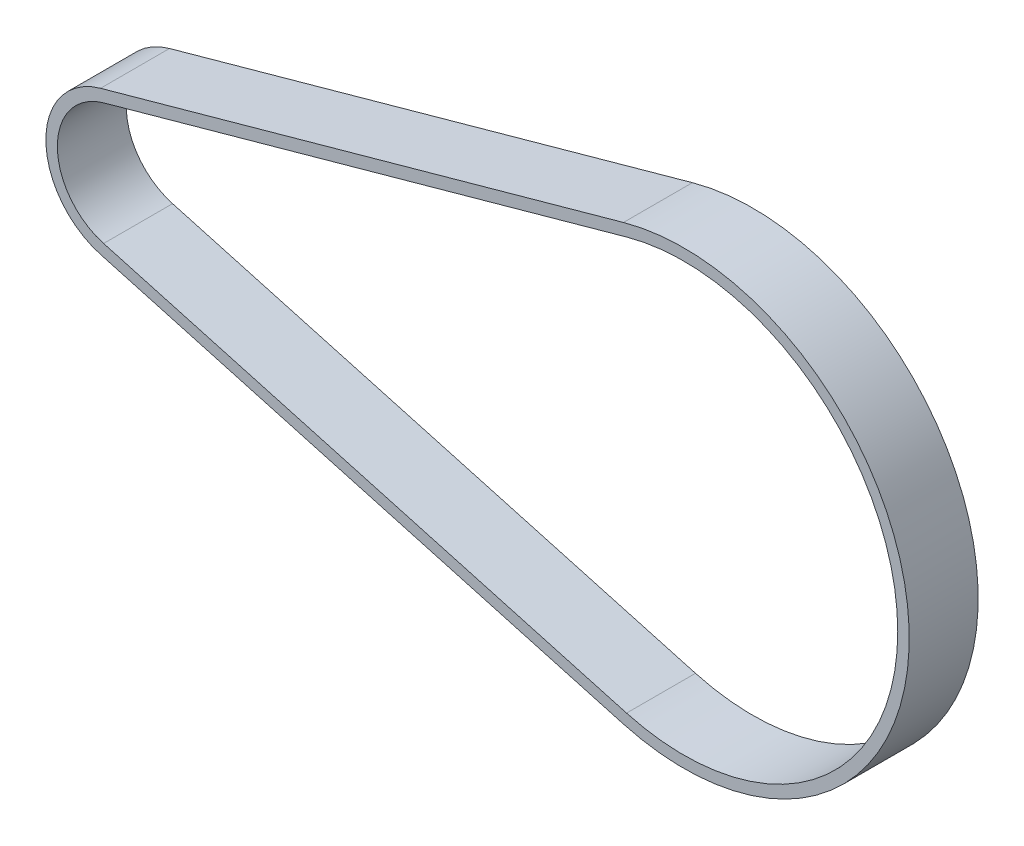
ISO-10303-21;
HEADER;
FILE_DESCRIPTION(('STEP AP214'),'2;1');
FILE_NAME('part.step','',(''),(''),'','','');
FILE_SCHEMA(('AUTOMOTIVE_DESIGN { 1 0 10303 214 1 1 1 1 }'));
ENDSEC;
DATA;
#1=APPLICATION_CONTEXT('core data for automotive mechanical design processes');
#2=APPLICATION_PROTOCOL_DEFINITION('international standard','automotive_design',2000,#1);
#3=PRODUCT_CONTEXT('',#1,'mechanical');
#4=PRODUCT('Part','Part','',(#3));
#5=PRODUCT_RELATED_PRODUCT_CATEGORY('part','',(#4));
#6=PRODUCT_DEFINITION_FORMATION('','',#4);
#7=PRODUCT_DEFINITION_CONTEXT('part definition',#1,'design');
#8=PRODUCT_DEFINITION('design','',#6,#7);
#9=PRODUCT_DEFINITION_SHAPE('','',#8);
#10=(LENGTH_UNIT() NAMED_UNIT(*) SI_UNIT(.MILLI.,.METRE.));
#11=(NAMED_UNIT(*) PLANE_ANGLE_UNIT() SI_UNIT($,.RADIAN.));
#12=(NAMED_UNIT(*) SI_UNIT($,.STERADIAN.) SOLID_ANGLE_UNIT());
#13=UNCERTAINTY_MEASURE_WITH_UNIT(LENGTH_MEASURE(1.E-05),#10,'distance_accuracy_value','');
#14=(GEOMETRIC_REPRESENTATION_CONTEXT(3) GLOBAL_UNCERTAINTY_ASSIGNED_CONTEXT((#13)) GLOBAL_UNIT_ASSIGNED_CONTEXT((#10,
#11,#12)) REPRESENTATION_CONTEXT('',''));
#15=CARTESIAN_POINT('',(0.,0.,0.));
#16=DIRECTION('',(0.,0.,1.));
#17=DIRECTION('',(1.,0.,0.));
#18=AXIS2_PLACEMENT_3D('',#15,#16,#17);
#19=CARTESIAN_POINT('',(0.,0.,6.));
#20=DIRECTION('',(0.,0.,1.));
#21=DIRECTION('',(1.,0.,0.));
#22=AXIS2_PLACEMENT_3D('',#19,#20,#21);
#23=PLANE('',#22);
#24=CARTESIAN_POINT('',(0.,0.,6.));
#25=DIRECTION('',(0.,0.,1.));
#26=DIRECTION('',(1.,0.,0.));
#27=AXIS2_PLACEMENT_3D('',#24,#25,#26);
#28=CIRCLE('',#27,6.5);
#29=CARTESIAN_POINT('',(-1.73969808241534,6.2628628104119,6.));
#30=VERTEX_POINT('',#29);
#31=CARTESIAN_POINT('',(-1.73969808241534,-6.26286281041189,6.));
#32=VERTEX_POINT('',#31);
#33=EDGE_CURVE('E153',#30,#32,#28,.T.);
#34=ORIENTED_EDGE('',*,*,#33,.T.);
#35=DIRECTION('',(0.963517355447984,-0.267645858833129,0.));
#36=VECTOR('',#35,1.);
#37=CARTESIAN_POINT('',(-1.73969808241534,-6.26286281041189,6.));
#38=LINE('',#37,#36);
#39=CARTESIAN_POINT('',(43.768788249694,-18.9042105138894,6.));
#40=VERTEX_POINT('',#39);
#41=EDGE_CURVE('E157',#32,#40,#38,.T.);
#42=ORIENTED_EDGE('',*,*,#41,.T.);
#43=CARTESIAN_POINT('',(49.02,0.,6.));
#44=DIRECTION('',(0.,0.,1.));
#45=DIRECTION('',(1.,0.,0.));
#46=AXIS2_PLACEMENT_3D('',#43,#44,#45);
#47=CIRCLE('',#46,19.62);
#48=CARTESIAN_POINT('',(43.768788249694,18.9042105138894,6.));
#49=VERTEX_POINT('',#48);
#50=EDGE_CURVE('E161',#40,#49,#47,.T.);
#51=ORIENTED_EDGE('',*,*,#50,.T.);
#52=DIRECTION('',(-0.963517355447984,-0.267645858833129,0.));
#53=VECTOR('',#52,1.);
#54=CARTESIAN_POINT('',(-1.73969808241534,6.2628628104119,6.));
#55=LINE('',#54,#53);
#56=EDGE_CURVE('E164',#49,#30,#55,.T.);
#57=ORIENTED_EDGE('',*,*,#56,.T.);
#58=EDGE_LOOP('',(#34,#42,#51,#57));
#59=FACE_BOUND('',#58,.T.);
#60=DIRECTION('',(0.963517355447984,-0.267645858833129,0.));
#61=VECTOR('',#60,1.);
#62=CARTESIAN_POINT('',(-1.47205222358221,-5.29934545496391,6.));
#63=LINE('',#62,#61);
#64=CARTESIAN_POINT('',(-1.47205222358221,-5.29934545496391,6.));
#65=VERTEX_POINT('',#64);
#66=CARTESIAN_POINT('',(44.0364341085271,-17.9406931584415,6.));
#67=VERTEX_POINT('',#66);
#68=EDGE_CURVE('E114',#65,#67,#63,.T.);
#69=ORIENTED_EDGE('',*,*,#68,.F.);
#70=CARTESIAN_POINT('',(0.,0.,6.));
#71=DIRECTION('',(0.,0.,1.));
#72=DIRECTION('',(1.,0.,0.));
#73=AXIS2_PLACEMENT_3D('',#70,#71,#72);
#74=CIRCLE('',#73,5.5);
#75=CARTESIAN_POINT('',(-1.47205222358221,5.29934545496391,6.));
#76=VERTEX_POINT('',#75);
#77=EDGE_CURVE('E105',#76,#65,#74,.T.);
#78=ORIENTED_EDGE('',*,*,#77,.F.);
#79=DIRECTION('',(-0.963517355447984,-0.267645858833129,0.));
#80=VECTOR('',#79,1.);
#81=CARTESIAN_POINT('',(-1.47205222358221,5.29934545496391,6.));
#82=LINE('',#81,#80);
#83=CARTESIAN_POINT('',(44.0364341085271,17.9406931584415,6.));
#84=VERTEX_POINT('',#83);
#85=EDGE_CURVE('E131',#84,#76,#82,.T.);
#86=ORIENTED_EDGE('',*,*,#85,.F.);
#87=CARTESIAN_POINT('',(49.02,0.,6.));
#88=DIRECTION('',(0.,0.,1.));
#89=DIRECTION('',(1.,0.,0.));
#90=AXIS2_PLACEMENT_3D('',#87,#88,#89);
#91=CIRCLE('',#90,18.62);
#92=EDGE_CURVE('E127',#67,#84,#91,.T.);
#93=ORIENTED_EDGE('',*,*,#92,.F.);
#94=EDGE_LOOP('',(#69,#78,#86,#93));
#95=FACE_BOUND('',#94,.T.);
#96=ADVANCED_FACE('F39',(#59,#95),#23,.T.);
#97=CARTESIAN_POINT('',(0.,0.,0.));
#98=DIRECTION('',(0.,0.,1.));
#99=DIRECTION('',(1.,0.,0.));
#100=AXIS2_PLACEMENT_3D('',#97,#98,#99);
#101=PLANE('',#100);
#102=CARTESIAN_POINT('',(0.,0.,0.));
#103=DIRECTION('',(0.,0.,1.));
#104=DIRECTION('',(1.,0.,0.));
#105=AXIS2_PLACEMENT_3D('',#102,#103,#104);
#106=CIRCLE('',#105,6.5);
#107=CARTESIAN_POINT('',(-1.73969808241534,6.2628628104119,0.));
#108=VERTEX_POINT('',#107);
#109=CARTESIAN_POINT('',(-1.73969808241534,-6.26286281041189,0.));
#110=VERTEX_POINT('',#109);
#111=EDGE_CURVE('E123',#108,#110,#106,.T.);
#112=ORIENTED_EDGE('',*,*,#111,.F.);
#113=DIRECTION('',(-0.963517355447984,-0.267645858833129,0.));
#114=VECTOR('',#113,1.);
#115=CARTESIAN_POINT('',(-1.73969808241534,6.2628628104119,0.));
#116=LINE('',#115,#114);
#117=CARTESIAN_POINT('',(43.768788249694,18.9042105138894,0.));
#118=VERTEX_POINT('',#117);
#119=EDGE_CURVE('E158',#118,#108,#116,.T.);
#120=ORIENTED_EDGE('',*,*,#119,.F.);
#121=CARTESIAN_POINT('',(49.02,0.,0.));
#122=DIRECTION('',(0.,0.,1.));
#123=DIRECTION('',(1.,0.,0.));
#124=AXIS2_PLACEMENT_3D('',#121,#122,#123);
#125=CIRCLE('',#124,19.62);
#126=CARTESIAN_POINT('',(43.768788249694,-18.9042105138894,0.));
#127=VERTEX_POINT('',#126);
#128=EDGE_CURVE('E174',#127,#118,#125,.T.);
#129=ORIENTED_EDGE('',*,*,#128,.F.);
#130=DIRECTION('',(0.963517355447984,-0.267645858833129,0.));
#131=VECTOR('',#130,1.);
#132=CARTESIAN_POINT('',(-1.73969808241534,-6.26286281041189,0.));
#133=LINE('',#132,#131);
#134=EDGE_CURVE('E171',#110,#127,#133,.T.);
#135=ORIENTED_EDGE('',*,*,#134,.F.);
#136=EDGE_LOOP('',(#112,#120,#129,#135));
#137=FACE_BOUND('',#136,.T.);
#138=CARTESIAN_POINT('',(0.,0.,0.));
#139=DIRECTION('',(0.,0.,1.));
#140=DIRECTION('',(1.,0.,0.));
#141=AXIS2_PLACEMENT_3D('',#138,#139,#140);
#142=CIRCLE('',#141,5.5);
#143=CARTESIAN_POINT('',(-1.47205222358221,5.29934545496391,0.));
#144=VERTEX_POINT('',#143);
#145=CARTESIAN_POINT('',(-1.47205222358221,-5.29934545496391,0.));
#146=VERTEX_POINT('',#145);
#147=EDGE_CURVE('E63',#144,#146,#142,.T.);
#148=ORIENTED_EDGE('',*,*,#147,.T.);
#149=DIRECTION('',(0.963517355447984,-0.267645858833129,0.));
#150=VECTOR('',#149,1.);
#151=CARTESIAN_POINT('',(-1.47205222358221,-5.29934545496391,0.));
#152=LINE('',#151,#150);
#153=CARTESIAN_POINT('',(44.0364341085271,-17.9406931584415,0.));
#154=VERTEX_POINT('',#153);
#155=EDGE_CURVE('E121',#146,#154,#152,.T.);
#156=ORIENTED_EDGE('',*,*,#155,.T.);
#157=CARTESIAN_POINT('',(49.02,0.,0.));
#158=DIRECTION('',(0.,0.,1.));
#159=DIRECTION('',(1.,0.,0.));
#160=AXIS2_PLACEMENT_3D('',#157,#158,#159);
#161=CIRCLE('',#160,18.62);
#162=CARTESIAN_POINT('',(44.0364341085271,17.9406931584415,0.));
#163=VERTEX_POINT('',#162);
#164=EDGE_CURVE('E140',#154,#163,#161,.T.);
#165=ORIENTED_EDGE('',*,*,#164,.T.);
#166=DIRECTION('',(-0.963517355447984,-0.267645858833129,0.));
#167=VECTOR('',#166,1.);
#168=CARTESIAN_POINT('',(-1.47205222358221,5.29934545496391,0.));
#169=LINE('',#168,#167);
#170=EDGE_CURVE('E115',#163,#144,#169,.T.);
#171=ORIENTED_EDGE('',*,*,#170,.T.);
#172=EDGE_LOOP('',(#148,#156,#165,#171));
#173=FACE_BOUND('',#172,.T.);
#174=ADVANCED_FACE('F197',(#137,#173),#101,.F.);
#175=CARTESIAN_POINT('',(0.,0.,6.));
#176=DIRECTION('',(0.,0.,-1.));
#177=DIRECTION('',(-1.,0.,0.));
#178=AXIS2_PLACEMENT_3D('',#175,#176,#177);
#179=CYLINDRICAL_SURFACE('',#178,6.5);
#180=ORIENTED_EDGE('',*,*,#111,.T.);
#181=DIRECTION('',(0.,0.,-1.));
#182=VECTOR('',#181,1.);
#183=CARTESIAN_POINT('',(-1.73969808241534,-6.26286281041189,6.));
#184=LINE('',#183,#182);
#185=EDGE_CURVE('E11',#32,#110,#184,.T.);
#186=ORIENTED_EDGE('',*,*,#185,.F.);
#187=ORIENTED_EDGE('',*,*,#33,.F.);
#188=DIRECTION('',(0.,0.,-1.));
#189=VECTOR('',#188,1.);
#190=CARTESIAN_POINT('',(-1.73969808241534,6.2628628104119,6.));
#191=LINE('',#190,#189);
#192=EDGE_CURVE('E167',#30,#108,#191,.T.);
#193=ORIENTED_EDGE('',*,*,#192,.T.);
#194=EDGE_LOOP('',(#180,#186,#187,#193));
#195=FACE_BOUND('',#194,.T.);
#196=ADVANCED_FACE('F41',(#195),#179,.T.);
#197=CARTESIAN_POINT('',(-1.73969808241534,-6.26286281041189,6.));
#198=DIRECTION('',(0.267645858833129,0.963517355447984,0.));
#199=DIRECTION('',(-0.963517355447984,0.267645858833129,0.));
#200=AXIS2_PLACEMENT_3D('',#197,#198,#199);
#201=PLANE('',#200);
#202=ORIENTED_EDGE('',*,*,#134,.T.);
#203=DIRECTION('',(0.,0.,-1.));
#204=VECTOR('',#203,1.);
#205=CARTESIAN_POINT('',(43.768788249694,-18.9042105138894,6.));
#206=LINE('',#205,#204);
#207=EDGE_CURVE('E48',#40,#127,#206,.T.);
#208=ORIENTED_EDGE('',*,*,#207,.F.);
#209=ORIENTED_EDGE('',*,*,#41,.F.);
#210=ORIENTED_EDGE('',*,*,#185,.T.);
#211=EDGE_LOOP('',(#202,#208,#209,#210));
#212=FACE_BOUND('',#211,.T.);
#213=ADVANCED_FACE('F207',(#212),#201,.F.);
#214=CARTESIAN_POINT('',(49.02,0.,6.));
#215=DIRECTION('',(0.,0.,-1.));
#216=DIRECTION('',(-1.,0.,0.));
#217=AXIS2_PLACEMENT_3D('',#214,#215,#216);
#218=CYLINDRICAL_SURFACE('',#217,19.62);
#219=ORIENTED_EDGE('',*,*,#128,.T.);
#220=DIRECTION('',(0.,0.,-1.));
#221=VECTOR('',#220,1.);
#222=CARTESIAN_POINT('',(43.768788249694,18.9042105138894,6.));
#223=LINE('',#222,#221);
#224=EDGE_CURVE('E182',#49,#118,#223,.T.);
#225=ORIENTED_EDGE('',*,*,#224,.F.);
#226=ORIENTED_EDGE('',*,*,#50,.F.);
#227=ORIENTED_EDGE('',*,*,#207,.T.);
#228=EDGE_LOOP('',(#219,#225,#226,#227));
#229=FACE_BOUND('',#228,.T.);
#230=ADVANCED_FACE('F191',(#229),#218,.T.);
#231=CARTESIAN_POINT('',(-1.73969808241534,6.2628628104119,6.));
#232=DIRECTION('',(0.267645858833129,-0.963517355447984,0.));
#233=DIRECTION('',(0.963517355447984,0.267645858833129,0.));
#234=AXIS2_PLACEMENT_3D('',#231,#232,#233);
#235=PLANE('',#234);
#236=ORIENTED_EDGE('',*,*,#119,.T.);
#237=ORIENTED_EDGE('',*,*,#192,.F.);
#238=ORIENTED_EDGE('',*,*,#56,.F.);
#239=ORIENTED_EDGE('',*,*,#224,.T.);
#240=EDGE_LOOP('',(#236,#237,#238,#239));
#241=FACE_BOUND('',#240,.T.);
#242=ADVANCED_FACE('F201',(#241),#235,.F.);
#243=CARTESIAN_POINT('',(0.,0.,6.));
#244=DIRECTION('',(0.,0.,-1.));
#245=DIRECTION('',(-1.,0.,0.));
#246=AXIS2_PLACEMENT_3D('',#243,#244,#245);
#247=CYLINDRICAL_SURFACE('',#246,5.5);
#248=ORIENTED_EDGE('',*,*,#147,.F.);
#249=DIRECTION('',(0.,0.,-1.));
#250=VECTOR('',#249,1.);
#251=CARTESIAN_POINT('',(-1.47205222358221,5.29934545496391,6.));
#252=LINE('',#251,#250);
#253=EDGE_CURVE('E109',#76,#144,#252,.T.);
#254=ORIENTED_EDGE('',*,*,#253,.F.);
#255=ORIENTED_EDGE('',*,*,#77,.T.);
#256=DIRECTION('',(0.,0.,-1.));
#257=VECTOR('',#256,1.);
#258=CARTESIAN_POINT('',(-1.47205222358221,-5.29934545496391,6.));
#259=LINE('',#258,#257);
#260=EDGE_CURVE('E108',#65,#146,#259,.T.);
#261=ORIENTED_EDGE('',*,*,#260,.T.);
#262=EDGE_LOOP('',(#248,#254,#255,#261));
#263=FACE_BOUND('',#262,.T.);
#264=ADVANCED_FACE('F107',(#263),#247,.F.);
#265=CARTESIAN_POINT('',(-1.47205222358221,-5.29934545496391,6.));
#266=DIRECTION('',(0.267645858833129,0.963517355447984,0.));
#267=DIRECTION('',(-0.963517355447984,0.267645858833129,0.));
#268=AXIS2_PLACEMENT_3D('',#265,#266,#267);
#269=PLANE('',#268);
#270=ORIENTED_EDGE('',*,*,#155,.F.);
#271=ORIENTED_EDGE('',*,*,#260,.F.);
#272=ORIENTED_EDGE('',*,*,#68,.T.);
#273=DIRECTION('',(0.,0.,-1.));
#274=VECTOR('',#273,1.);
#275=CARTESIAN_POINT('',(44.0364341085271,-17.9406931584415,6.));
#276=LINE('',#275,#274);
#277=EDGE_CURVE('E124',#67,#154,#276,.T.);
#278=ORIENTED_EDGE('',*,*,#277,.T.);
#279=EDGE_LOOP('',(#270,#271,#272,#278));
#280=FACE_BOUND('',#279,.T.);
#281=ADVANCED_FACE('F118',(#280),#269,.T.);
#282=CARTESIAN_POINT('',(49.02,0.,6.));
#283=DIRECTION('',(0.,0.,-1.));
#284=DIRECTION('',(-1.,0.,0.));
#285=AXIS2_PLACEMENT_3D('',#282,#283,#284);
#286=CYLINDRICAL_SURFACE('',#285,18.62);
#287=ORIENTED_EDGE('',*,*,#164,.F.);
#288=ORIENTED_EDGE('',*,*,#277,.F.);
#289=ORIENTED_EDGE('',*,*,#92,.T.);
#290=DIRECTION('',(0.,0.,-1.));
#291=VECTOR('',#290,1.);
#292=CARTESIAN_POINT('',(44.0364341085271,17.9406931584415,6.));
#293=LINE('',#292,#291);
#294=EDGE_CURVE('E55',#84,#163,#293,.T.);
#295=ORIENTED_EDGE('',*,*,#294,.T.);
#296=EDGE_LOOP('',(#287,#288,#289,#295));
#297=FACE_BOUND('',#296,.T.);
#298=ADVANCED_FACE('F230',(#297),#286,.F.);
#299=CARTESIAN_POINT('',(-1.47205222358221,5.29934545496391,6.));
#300=DIRECTION('',(0.267645858833129,-0.963517355447984,0.));
#301=DIRECTION('',(0.963517355447984,0.267645858833129,0.));
#302=AXIS2_PLACEMENT_3D('',#299,#300,#301);
#303=PLANE('',#302);
#304=ORIENTED_EDGE('',*,*,#170,.F.);
#305=ORIENTED_EDGE('',*,*,#294,.F.);
#306=ORIENTED_EDGE('',*,*,#85,.T.);
#307=ORIENTED_EDGE('',*,*,#253,.T.);
#308=EDGE_LOOP('',(#304,#305,#306,#307));
#309=FACE_BOUND('',#308,.T.);
#310=ADVANCED_FACE('F234',(#309),#303,.T.);
#311=CLOSED_SHELL('',(#96,#174,#196,#213,#230,#242,#264,#281,#298,#310));
#312=MANIFOLD_SOLID_BREP('B2',#311);
#313=ADVANCED_BREP_SHAPE_REPRESENTATION('',(#18,#312),#14);
#314=SHAPE_DEFINITION_REPRESENTATION(#9,#313);
ENDSEC;
END-ISO-10303-21;
